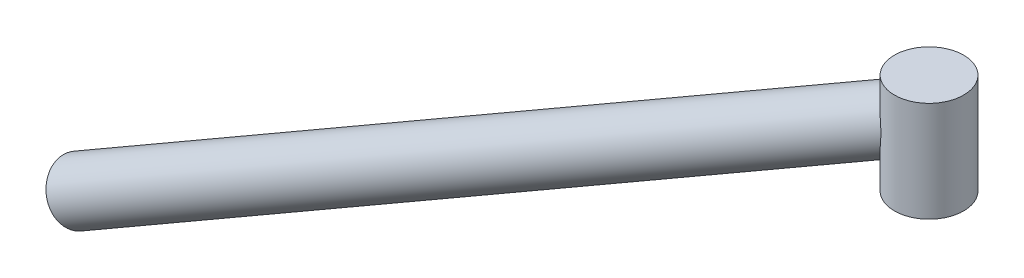
ISO-10303-21;
HEADER;
FILE_DESCRIPTION(('STEP AP214'),'2;1');
FILE_NAME('part.step','',(''),(''),'','','');
FILE_SCHEMA(('AUTOMOTIVE_DESIGN { 1 0 10303 214 1 1 1 1 }'));
ENDSEC;
DATA;
#1=APPLICATION_CONTEXT('core data for automotive mechanical design processes');
#2=APPLICATION_PROTOCOL_DEFINITION('international standard','automotive_design',2000,#1);
#3=PRODUCT_CONTEXT('',#1,'mechanical');
#4=PRODUCT('Part','Part','',(#3));
#5=PRODUCT_RELATED_PRODUCT_CATEGORY('part','',(#4));
#6=PRODUCT_DEFINITION_FORMATION('','',#4);
#7=PRODUCT_DEFINITION_CONTEXT('part definition',#1,'design');
#8=PRODUCT_DEFINITION('design','',#6,#7);
#9=PRODUCT_DEFINITION_SHAPE('','',#8);
#10=(LENGTH_UNIT() NAMED_UNIT(*) SI_UNIT(.MILLI.,.METRE.));
#11=(NAMED_UNIT(*) PLANE_ANGLE_UNIT() SI_UNIT($,.RADIAN.));
#12=(NAMED_UNIT(*) SI_UNIT($,.STERADIAN.) SOLID_ANGLE_UNIT());
#13=UNCERTAINTY_MEASURE_WITH_UNIT(LENGTH_MEASURE(1.E-05),#10,'distance_accuracy_value','');
#14=(GEOMETRIC_REPRESENTATION_CONTEXT(3) GLOBAL_UNCERTAINTY_ASSIGNED_CONTEXT((#13)) GLOBAL_UNIT_ASSIGNED_CONTEXT((#10,
#11,#12)) REPRESENTATION_CONTEXT('',''));
#15=CARTESIAN_POINT('',(0.,0.,0.));
#16=DIRECTION('',(0.,0.,1.));
#17=DIRECTION('',(1.,0.,0.));
#18=AXIS2_PLACEMENT_3D('',#15,#16,#17);
#19=CARTESIAN_POINT('',(-6.39999999999964,51.,-79.));
#20=DIRECTION('',(0.,-1.,0.));
#21=DIRECTION('',(0.,0.,-1.));
#22=AXIS2_PLACEMENT_3D('',#19,#20,#21);
#23=CYLINDRICAL_SURFACE('',#22,5.);
#24=CARTESIAN_POINT('',(-6.39999999999964,51.,-79.));
#25=DIRECTION('',(0.,1.,0.));
#26=DIRECTION('',(0.,0.,1.));
#27=AXIS2_PLACEMENT_3D('',#24,#25,#26);
#28=CIRCLE('',#27,5.);
#29=CARTESIAN_POINT('',(-6.39999999999964,51.,-74.));
#30=VERTEX_POINT('',#29);
#31=EDGE_CURVE('E49',#30,#30,#28,.T.);
#32=ORIENTED_EDGE('',*,*,#31,.F.);
#33=EDGE_LOOP('',(#32));
#34=FACE_BOUND('',#33,.T.);
#35=CARTESIAN_POINT('',(-6.39999999999964,36.5,-79.));
#36=DIRECTION('',(0.,1.,0.));
#37=DIRECTION('',(0.,0.,1.));
#38=AXIS2_PLACEMENT_3D('',#35,#36,#37);
#39=CIRCLE('',#38,5.);
#40=CARTESIAN_POINT('',(-6.39999999999964,36.5,-74.));
#41=VERTEX_POINT('',#40);
#42=EDGE_CURVE('E53',#41,#41,#39,.T.);
#43=ORIENTED_EDGE('',*,*,#42,.T.);
#44=EDGE_LOOP('',(#43));
#45=FACE_BOUND('',#44,.T.);
#46=CARTESIAN_POINT('',(-11.3999999999996,47.8475208614068,-79.));
#47=CARTESIAN_POINT('',(-11.3999992229784,47.8475205327653,-79.1110554380289));
#48=CARTESIAN_POINT('',(-11.396293931852,47.8444446836934,-79.222129018591));
#49=CARTESIAN_POINT('',(-11.3815291011046,47.8321550194603,-79.4434891377847));
#50=CARTESIAN_POINT('',(-11.3704659182794,47.8229381636223,-79.553775259156));
#51=CARTESIAN_POINT('',(-11.3411427802475,47.7983946090221,-79.7728795706532));
#52=CARTESIAN_POINT('',(-11.3228714048445,47.7830582144133,-79.881695146609));
#53=CARTESIAN_POINT('',(-11.2794235301905,47.7463444012652,-80.0969442872655));
#54=CARTESIAN_POINT('',(-11.2542442553713,47.7249645543844,-80.2033768758589));
#55=CARTESIAN_POINT('',(-11.197489707094,47.6763413688083,-80.4127331478953));
#56=CARTESIAN_POINT('',(-11.1659368445519,47.6491185548287,-80.5156676892563));
#57=CARTESIAN_POINT('',(-11.0968652602814,47.588842162786,-80.7178097464796));
#58=CARTESIAN_POINT('',(-11.059343862608,47.5557859686429,-80.8170155658171));
#59=CARTESIAN_POINT('',(-10.9789418646129,47.4839312688032,-81.0110488045613));
#60=CARTESIAN_POINT('',(-10.9360624030223,47.4451339829191,-81.1058771484509));
#61=CARTESIAN_POINT('',(-10.8456098049975,47.3618279694557,-81.2906628943287));
#62=CARTESIAN_POINT('',(-10.798036431151,47.3173189529495,-81.3806200495811));
#63=CARTESIAN_POINT('',(-10.6969475169335,47.220649669208,-81.5587392712517));
#64=CARTESIAN_POINT('',(-10.6432691910973,47.1682522221213,-81.6466803871615));
#65=CARTESIAN_POINT('',(-10.5326591410421,47.0571756528111,-81.8162697842387));
#66=CARTESIAN_POINT('',(-10.475728514145,46.9984986435358,-81.8979201663078));
#67=CARTESIAN_POINT('',(-10.3597146076771,46.8746187908213,-82.0545292313537));
#68=CARTESIAN_POINT('',(-10.3006308215253,46.8094144052778,-82.1294863250779));
#69=CARTESIAN_POINT('',(-10.1817303635427,46.6722293778425,-82.272179599625));
#70=CARTESIAN_POINT('',(-10.1219139086505,46.6002507015092,-82.3399178629005));
#71=CARTESIAN_POINT('',(-9.97337970422013,46.4111815501261,-82.4997104830389));
#72=CARTESIAN_POINT('',(-9.88515259371044,46.289518700598,-82.5870063404849));
#73=CARTESIAN_POINT('',(-9.75984444877365,46.0941533620128,-82.7033416007751));
#74=CARTESIAN_POINT('',(-9.71927226024193,46.0269362820177,-82.7396655966477));
#75=CARTESIAN_POINT('',(-9.64151479841437,45.8881501483869,-82.8072591530033));
#76=CARTESIAN_POINT('',(-9.60432886124454,45.8165819523948,-82.8385297051485));
#77=CARTESIAN_POINT('',(-9.51058641853408,45.6187540909089,-82.9153600686762));
#78=CARTESIAN_POINT('',(-9.45815621363705,45.4885390437009,-82.9560834206885));
#79=CARTESIAN_POINT('',(-9.37102916105725,45.2186823273215,-83.0219441305111));
#80=CARTESIAN_POINT('',(-9.33631800895744,45.0790483653853,-83.0470940640949));
#81=CARTESIAN_POINT('',(-9.2865353867326,44.7950445184321,-83.0827508484919));
#82=CARTESIAN_POINT('',(-9.27140616174943,44.6506898538498,-83.0933007669323));
#83=CARTESIAN_POINT('',(-9.25893206158393,44.3608486270469,-83.102016418999));
#84=CARTESIAN_POINT('',(-9.26160995031267,44.2153608535711,-83.1001663008844));
#85=CARTESIAN_POINT('',(-9.28018279853618,43.942529896089,-83.0871302526609));
#86=CARTESIAN_POINT('',(-9.2945355485267,43.8150097072755,-83.0770331161171));
#87=CARTESIAN_POINT('',(-9.33203867695008,43.561933255003,-83.0501455339816));
#88=CARTESIAN_POINT('',(-9.35519632697204,43.4363787043544,-83.0333495555409));
#89=CARTESIAN_POINT('',(-9.40833801033599,43.1870989002206,-82.9938702745481));
#90=CARTESIAN_POINT('',(-9.43835258084678,43.0633845498162,-82.9711605700563));
#91=CARTESIAN_POINT('',(-9.50349544361375,42.8183822000642,-82.9204617514195));
#92=CARTESIAN_POINT('',(-9.53862566120881,42.6970951338914,-82.8924706483749));
#93=CARTESIAN_POINT('',(-9.6102365949064,42.4649901550913,-82.8335864418999));
#94=CARTESIAN_POINT('',(-9.64647031521966,42.354014136856,-82.803012120419));
#95=CARTESIAN_POINT('',(-9.7214687886046,42.1341593562682,-82.737689168772));
#96=CARTESIAN_POINT('',(-9.76023392539726,42.0252809151284,-82.7029399050799));
#97=CARTESIAN_POINT('',(-9.87938967081735,41.7016071393284,-82.5924339936332));
#98=CARTESIAN_POINT('',(-9.96259096306286,41.4899279890429,-82.5104586324617));
#99=CARTESIAN_POINT('',(-10.1322020861713,41.0761604432275,-82.329570186268));
#100=CARTESIAN_POINT('',(-10.2186014814038,40.8740450433067,-82.2307089398174));
#101=CARTESIAN_POINT('',(-10.3916658253532,40.4804338993671,-82.0142670061129));
#102=CARTESIAN_POINT('',(-10.4783303393071,40.2889258816665,-81.896708590141));
#103=CARTESIAN_POINT('',(-10.6416967881503,39.9349005447772,-81.6510219017775));
#104=CARTESIAN_POINT('',(-10.7186228123175,39.7713001713987,-81.5246192827154));
#105=CARTESIAN_POINT('',(-10.8672085761983,39.4593729807759,-81.2512750640478));
#106=CARTESIAN_POINT('',(-10.938871633056,39.3110365189218,-81.1043465739717));
#107=CARTESIAN_POINT('',(-11.0622791837996,39.0579228297004,-80.8122285781369));
#108=CARTESIAN_POINT('',(-11.115383009238,38.9499648738423,-80.6704124470262));
#109=CARTESIAN_POINT('',(-11.2114084251477,38.7558207940163,-80.3693647639391));
#110=CARTESIAN_POINT('',(-11.2543498898442,38.6695921528949,-80.2101681091291));
#111=CARTESIAN_POINT('',(-11.3161836514966,38.5458382672254,-79.9202637804331));
#112=CARTESIAN_POINT('',(-11.3384343009445,38.5014599571779,-79.7932255514448));
#113=CARTESIAN_POINT('',(-11.3732739353825,38.4320691205101,-79.5326854446598));
#114=CARTESIAN_POINT('',(-11.3858732449562,38.4070358991017,-79.3991906368749));
#115=CARTESIAN_POINT('',(-11.4001882350517,38.378598904791,-79.1286126933062));
#116=CARTESIAN_POINT('',(-11.4018502138869,38.3753018551448,-78.9915151655561));
#117=CARTESIAN_POINT('',(-11.3939565009427,38.3909775004066,-78.7189194175626));
#118=CARTESIAN_POINT('',(-11.3843974332793,38.4099568972472,-78.5834216910143));
#119=CARTESIAN_POINT('',(-11.3560212920071,38.4664187111979,-78.3265596784376));
#120=CARTESIAN_POINT('',(-11.3378275580682,38.5026558243465,-78.204843384422));
#121=CARTESIAN_POINT('',(-11.2939280931413,38.5903458483453,-77.9685256078964));
#122=CARTESIAN_POINT('',(-11.2682188833531,38.6418058057519,-77.8539274501162));
#123=CARTESIAN_POINT('',(-11.1935460058812,38.791841716895,-77.5663385529866));
#124=CARTESIAN_POINT('',(-11.1398935563921,38.9001451556884,-77.3996567489346));
#125=CARTESIAN_POINT('',(-11.0226210080207,39.1389634624519,-77.0870368613434));
#126=CARTESIAN_POINT('',(-10.9589753139462,39.2695354418387,-76.94115393192));
#127=CARTESIAN_POINT('',(-10.8367203036352,39.5232569112615,-76.6909960792047));
#128=CARTESIAN_POINT('',(-10.7790239175496,39.6440513251899,-76.5838321301511));
#129=CARTESIAN_POINT('',(-10.6610195361609,39.8940771915052,-76.381324361937));
#130=CARTESIAN_POINT('',(-10.6007096638819,40.0233147426363,-76.2859892344907));
#131=CARTESIAN_POINT('',(-10.4785788420036,40.288995762246,-76.1056792872115));
#132=CARTESIAN_POINT('',(-10.4167526248043,40.4254671241263,-76.0207494952293));
#133=CARTESIAN_POINT('',(-10.2930045276221,40.7039438969544,-75.8607750577996));
#134=CARTESIAN_POINT('',(-10.231082682015,40.845947630643,-75.7857274461129));
#135=CARTESIAN_POINT('',(-10.0869837096364,41.1847641883335,-75.6203568987994));
#136=CARTESIAN_POINT('',(-10.0052059877042,41.3835510379378,-75.533724495074));
#137=CARTESIAN_POINT('',(-9.84635688092458,41.7892430725911,-75.3757564103859));
#138=CARTESIAN_POINT('',(-9.76929077102183,41.9961569457407,-75.3044376575461));
#139=CARTESIAN_POINT('',(-9.66060000310784,42.3117748704866,-75.2091157228162));
#140=CARTESIAN_POINT('',(-9.62559560277406,42.4175997527981,-75.1793410263214));
#141=CARTESIAN_POINT('',(-9.55851632974841,42.6311810567547,-75.1237040668152));
#142=CARTESIAN_POINT('',(-9.52644090880752,42.7389371123851,-75.0978410710109));
#143=CARTESIAN_POINT('',(-9.46612180549731,42.9562349936052,-75.0502695365549));
#144=CARTESIAN_POINT('',(-9.43787197175808,43.0657736273342,-75.0285543048375));
#145=CARTESIAN_POINT('',(-9.3862377326798,43.2867510968499,-74.9895848671129));
#146=CARTESIAN_POINT('',(-9.3628512541393,43.398189100943,-74.9723287594598));
#147=CARTESIAN_POINT('',(-9.32756559093135,43.5937005054638,-74.9466422954631));
#148=CARTESIAN_POINT('',(-9.31426038299535,43.677367108177,-74.9370837030875));
#149=CARTESIAN_POINT('',(-9.29170999801386,43.8455108901805,-74.9210057135436));
#150=CARTESIAN_POINT('',(-9.28246465962471,43.9299880371225,-74.9144861955985));
#151=CARTESIAN_POINT('',(-9.26196188456384,44.1840917619314,-74.9000558673961));
#152=CARTESIAN_POINT('',(-9.25785260233332,44.3548223381953,-74.8972131402754));
#153=CARTESIAN_POINT('',(-9.27018124798364,44.6108758474982,-74.9058525042424));
#154=CARTESIAN_POINT('',(-9.27750956484766,44.6969161548667,-74.9109783341789));
#155=CARTESIAN_POINT('',(-9.29891400379229,44.8677450029225,-74.9261220115614));
#156=CARTESIAN_POINT('',(-9.31298942947586,44.9525336718659,-74.9361393541361));
#157=CARTESIAN_POINT('',(-9.34792872688326,45.1198512049708,-74.9614142022284));
#158=CARTESIAN_POINT('',(-9.36878812385445,45.2023815199606,-74.9766682539452));
#159=CARTESIAN_POINT('',(-9.41685893600908,45.3643335380135,-75.0125871301103));
#160=CARTESIAN_POINT('',(-9.44407010790946,45.4437553600007,-75.033251747329));
#161=CARTESIAN_POINT('',(-9.524839232145,45.6524890505364,-75.0962183698036));
#162=CARTESIAN_POINT('',(-9.5836007720281,45.7783035449559,-75.1435991776963));
#163=CARTESIAN_POINT('',(-9.71179483622048,46.01749862736,-75.2531228607862));
#164=CARTESIAN_POINT('',(-9.78124493051799,46.1308582061879,-75.3152901356549));
#165=CARTESIAN_POINT('',(-9.90611434430076,46.3163787224327,-75.4345389890108));
#166=CARTESIAN_POINT('',(-9.96029548033771,46.3914303039861,-75.4885059612357));
#167=CARTESIAN_POINT('',(-10.0698810375179,46.5352647713428,-75.6031984806925));
#168=CARTESIAN_POINT('',(-10.1252859307803,46.6040451833701,-75.6639266742096));
#169=CARTESIAN_POINT('',(-10.2359202398393,46.7356738614601,-75.7917505000289));
#170=CARTESIAN_POINT('',(-10.2911495061383,46.7985179528799,-75.8588505477323));
#171=CARTESIAN_POINT('',(-10.4002455254202,46.9185125270564,-75.9990093958095));
#172=CARTESIAN_POINT('',(-10.4541117173767,46.9756606929828,-76.0720705990999));
#173=CARTESIAN_POINT('',(-10.6142423586882,47.1410407323639,-76.3026814368424));
#174=CARTESIAN_POINT('',(-10.7168078853242,47.2406661320901,-76.4691535961862));
#175=CARTESIAN_POINT('',(-10.9052348004892,47.4177797314369,-76.8221774954137));
#176=CARTESIAN_POINT('',(-10.9910951408553,47.4952665421201,-77.0087304941247));
#177=CARTESIAN_POINT('',(-11.106510027003,47.5973516741523,-77.308392765722));
#178=CARTESIAN_POINT('',(-11.1438223843146,47.6299029154577,-77.4159208093363));
#179=CARTESIAN_POINT('',(-11.2114064612186,47.6883438653315,-77.6349095230018));
#180=CARTESIAN_POINT('',(-11.2416809643508,47.7142362079912,-77.7463686181267));
#181=CARTESIAN_POINT('',(-11.2945971155366,47.7592162411855,-77.9722087602904));
#182=CARTESIAN_POINT('',(-11.3172520219923,47.778315754876,-78.0865843553767));
#183=CARTESIAN_POINT('',(-11.354579776877,47.8096666409534,-78.3175030688698));
#184=CARTESIAN_POINT('',(-11.369257348953,47.8219220660729,-78.4340448622211));
#185=CARTESIAN_POINT('',(-11.3865286529413,47.836318919952,-78.6256609263415));
#186=CARTESIAN_POINT('',(-11.3915766393638,47.8405184375107,-78.700373841611));
#187=CARTESIAN_POINT('',(-11.3983125416984,47.8461194912889,-78.8500550848953));
#188=CARTESIAN_POINT('',(-11.4000005245881,47.8475210832817,-78.9250234077889));
#189=CARTESIAN_POINT('',(-11.3999999999996,47.8475208614068,-79.));
#190=B_SPLINE_CURVE_WITH_KNOTS('',3,(#46,#47,#48,#49,#50,#51,#52,#53,#54,#55,#56,#57,#58,#59,
#60,#61,#62,#63,#64,#65,#66,#67,#68,#69,#70,#71,#72,#73,#74,#75,#76,#77,#78,#79,#80,#81,#82,#83,
#84,#85,#86,#87,#88,#89,#90,#91,#92,#93,#94,#95,#96,#97,#98,#99,#100,#101,#102,#103,#104,#105,
#106,#107,#108,#109,#110,#111,#112,#113,#114,#115,#116,#117,#118,#119,#120,#121,#122,#123,#124,
#125,#126,#127,#128,#129,#130,#131,#132,#133,#134,#135,#136,#137,#138,#139,#140,#141,#142,#143,
#144,#145,#146,#147,#148,#149,#150,#151,#152,#153,#154,#155,#156,#157,#158,#159,#160,#161,#162,
#163,#164,#165,#166,#167,#168,#169,#170,#171,#172,#173,#174,#175,#176,#177,#178,#179,#180,#181,
#182,#183,#184,#185,#186,#187,#188,#189),.UNSPECIFIED.,.T.,.F.,(4,2,2,2,2,2,2,2,2,2,2,2,2,2,2,2,
2,2,2,2,2,2,2,2,2,2,2,2,2,2,2,2,2,2,2,2,2,2,2,2,2,2,2,2,2,2,2,2,2,2,2,2,2,2,2,2,2,2,2,2,2,2,2,2,
2,2,2,2,2,2,2,4),(0.,0.33309390319448,0.666352858206656,1.00014194144639,1.33406533680684,
1.66683440802796,1.9997530963039,2.33260115047599,2.66546604834808,3.01183750888396,
3.35809278656429,3.7044300615982,4.05066715495891,4.56987901818899,4.82913397357842,
5.08833799215761,5.52465724767076,5.96062370767034,6.39530137763761,6.83053482910485,
7.2161308431731,7.60204599857759,7.9897145331613,8.3775293506471,8.73943666080982,
9.10139895807012,9.82582335177705,10.5480625188265,11.2694477407637,11.9300394955221,
12.5902112540675,13.1463686217526,13.7014291708658,14.1090077372861,14.5161496826272,
14.9252891903322,15.3345518203843,15.7179469999538,16.1015199291279,16.7156680703183,
17.3314156586923,17.8451349993465,18.3592296086901,18.8754757151483,19.3915665100183,
20.0861035020033,20.7814043457714,21.1274270579636,21.4733848679736,21.8187796153725,
22.1640268211213,22.4196410480704,22.6752451157105,23.1851296165974,23.4443025365881,
23.7034487120259,23.9624242984307,24.2213899672869,24.6595125649735,25.0983632022116,
25.4194082363805,25.7405793695561,26.061974706551,26.3835002428337,27.0390423442033,
27.6946255641443,28.0493716591927,28.4039772090976,28.7579624998055,29.1117379549692,
29.336623327877,29.5615042179178),.UNSPECIFIED.);
#191=CARTESIAN_POINT('',(-11.3999999999996,47.8475208614068,-79.));
#192=VERTEX_POINT('',#191);
#193=EDGE_CURVE('E10',#192,#192,#190,.T.);
#194=ORIENTED_EDGE('',*,*,#193,.F.);
#195=EDGE_LOOP('',(#194));
#196=FACE_BOUND('',#195,.T.);
#197=ADVANCED_FACE('F39',(#34,#45,#196),#23,.T.);
#198=CARTESIAN_POINT('',(-6.39999999999964,51.,-79.));
#199=DIRECTION('',(0.,1.,0.));
#200=DIRECTION('',(0.,0.,1.));
#201=AXIS2_PLACEMENT_3D('',#198,#199,#200);
#202=PLANE('',#201);
#203=ORIENTED_EDGE('',*,*,#31,.T.);
#204=EDGE_LOOP('',(#203));
#205=FACE_BOUND('',#204,.T.);
#206=ADVANCED_FACE('F73',(#205),#202,.T.);
#207=CARTESIAN_POINT('',(-6.39999999999964,36.5,-79.));
#208=DIRECTION('',(0.,1.,0.));
#209=DIRECTION('',(0.,0.,1.));
#210=AXIS2_PLACEMENT_3D('',#207,#208,#209);
#211=PLANE('',#210);
#212=ORIENTED_EDGE('',*,*,#42,.F.);
#213=EDGE_LOOP('',(#212));
#214=FACE_BOUND('',#213,.T.);
#215=ADVANCED_FACE('F75',(#214),#211,.F.);
#216=CARTESIAN_POINT('',(-2.06987298107744,48.5,-79.));
#217=DIRECTION('',(0.866025403784439,0.5,0.));
#218=DIRECTION('',(-0.5,0.866025403784439,0.));
#219=AXIS2_PLACEMENT_3D('',#216,#217,#218);
#220=CYLINDRICAL_SURFACE('',#219,4.1);
#221=CARTESIAN_POINT('',(-129.37560733739,-25.,-79.));
#222=DIRECTION('',(0.866025403784439,0.5,0.));
#223=DIRECTION('',(-0.5,0.866025403784439,0.));
#224=AXIS2_PLACEMENT_3D('',#221,#222,#223);
#225=CIRCLE('',#224,4.10000000000001);
#226=CARTESIAN_POINT('',(-131.42560733739,-21.4492958444838,-79.));
#227=VERTEX_POINT('',#226);
#228=EDGE_CURVE('E56',#227,#227,#225,.T.);
#229=ORIENTED_EDGE('',*,*,#228,.T.);
#230=EDGE_LOOP('',(#229));
#231=FACE_BOUND('',#230,.T.);
#232=ORIENTED_EDGE('',*,*,#193,.T.);
#233=EDGE_LOOP('',(#232));
#234=FACE_BOUND('',#233,.T.);
#235=ADVANCED_FACE('F65',(#231,#234),#220,.T.);
#236=CARTESIAN_POINT('',(-129.37560733739,-25.,-79.));
#237=DIRECTION('',(0.866025403784439,0.5,0.));
#238=DIRECTION('',(-0.5,0.866025403784439,0.));
#239=AXIS2_PLACEMENT_3D('',#236,#237,#238);
#240=PLANE('',#239);
#241=ORIENTED_EDGE('',*,*,#228,.F.);
#242=EDGE_LOOP('',(#241));
#243=FACE_BOUND('',#242,.T.);
#244=ADVANCED_FACE('F67',(#243),#240,.F.);
#245=CLOSED_SHELL('',(#197,#206,#215,#235,#244));
#246=MANIFOLD_SOLID_BREP('B2',#245);
#247=ADVANCED_BREP_SHAPE_REPRESENTATION('',(#18,#246),#14);
#248=SHAPE_DEFINITION_REPRESENTATION(#9,#247);
ENDSEC;
END-ISO-10303-21;
